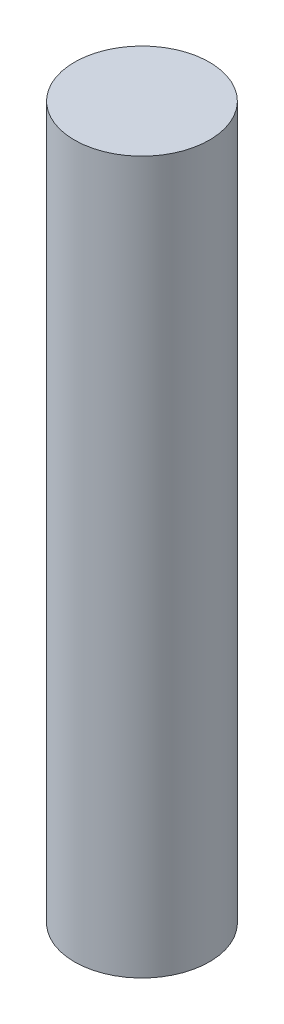
ISO-10303-21;
HEADER;
FILE_DESCRIPTION(('STEP AP214'),'2;1');
FILE_NAME('part.step','',(''),(''),'','','');
FILE_SCHEMA(('AUTOMOTIVE_DESIGN { 1 0 10303 214 1 1 1 1 }'));
ENDSEC;
DATA;
#1=APPLICATION_CONTEXT('core data for automotive mechanical design processes');
#2=APPLICATION_PROTOCOL_DEFINITION('international standard','automotive_design',2000,#1);
#3=PRODUCT_CONTEXT('',#1,'mechanical');
#4=PRODUCT('Part','Part','',(#3));
#5=PRODUCT_RELATED_PRODUCT_CATEGORY('part','',(#4));
#6=PRODUCT_DEFINITION_FORMATION('','',#4);
#7=PRODUCT_DEFINITION_CONTEXT('part definition',#1,'design');
#8=PRODUCT_DEFINITION('design','',#6,#7);
#9=PRODUCT_DEFINITION_SHAPE('','',#8);
#10=(LENGTH_UNIT() NAMED_UNIT(*) SI_UNIT(.MILLI.,.METRE.));
#11=(NAMED_UNIT(*) PLANE_ANGLE_UNIT() SI_UNIT($,.RADIAN.));
#12=(NAMED_UNIT(*) SI_UNIT($,.STERADIAN.) SOLID_ANGLE_UNIT());
#13=UNCERTAINTY_MEASURE_WITH_UNIT(LENGTH_MEASURE(1.E-05),#10,'distance_accuracy_value','');
#14=(GEOMETRIC_REPRESENTATION_CONTEXT(3) GLOBAL_UNCERTAINTY_ASSIGNED_CONTEXT((#13)) GLOBAL_UNIT_ASSIGNED_CONTEXT((#10,
#11,#12)) REPRESENTATION_CONTEXT('',''));
#15=CARTESIAN_POINT('',(0.,0.,0.));
#16=DIRECTION('',(0.,0.,1.));
#17=DIRECTION('',(1.,0.,0.));
#18=AXIS2_PLACEMENT_3D('',#15,#16,#17);
#19=CARTESIAN_POINT('',(0.,2900.,0.));
#20=DIRECTION('',(0.,-1.,0.));
#21=DIRECTION('',(0.,0.,-1.));
#22=AXIS2_PLACEMENT_3D('',#19,#20,#21);
#23=CYLINDRICAL_SURFACE('',#22,275.);
#24=CARTESIAN_POINT('',(0.,2900.,0.));
#25=DIRECTION('',(0.,1.,0.));
#26=DIRECTION('',(0.,0.,1.));
#27=AXIS2_PLACEMENT_3D('',#24,#25,#26);
#28=CIRCLE('',#27,275.);
#29=CARTESIAN_POINT('',(0.,2900.,275.));
#30=VERTEX_POINT('',#29);
#31=EDGE_CURVE('E10',#30,#30,#28,.T.);
#32=ORIENTED_EDGE('',*,*,#31,.F.);
#33=EDGE_LOOP('',(#32));
#34=FACE_BOUND('',#33,.T.);
#35=CARTESIAN_POINT('',(0.,0.,0.));
#36=DIRECTION('',(0.,1.,0.));
#37=DIRECTION('',(0.,0.,1.));
#38=AXIS2_PLACEMENT_3D('',#35,#36,#37);
#39=CIRCLE('',#38,275.);
#40=CARTESIAN_POINT('',(0.,0.,275.));
#41=VERTEX_POINT('',#40);
#42=EDGE_CURVE('E36',#41,#41,#39,.T.);
#43=ORIENTED_EDGE('',*,*,#42,.T.);
#44=EDGE_LOOP('',(#43));
#45=FACE_BOUND('',#44,.T.);
#46=ADVANCED_FACE('F33',(#34,#45),#23,.T.);
#47=CARTESIAN_POINT('',(0.,2900.,0.));
#48=DIRECTION('',(0.,1.,0.));
#49=DIRECTION('',(0.,0.,1.));
#50=AXIS2_PLACEMENT_3D('',#47,#48,#49);
#51=PLANE('',#50);
#52=ORIENTED_EDGE('',*,*,#31,.T.);
#53=EDGE_LOOP('',(#52));
#54=FACE_BOUND('',#53,.T.);
#55=ADVANCED_FACE('F48',(#54),#51,.T.);
#56=CARTESIAN_POINT('',(0.,0.,0.));
#57=DIRECTION('',(0.,1.,0.));
#58=DIRECTION('',(0.,0.,1.));
#59=AXIS2_PLACEMENT_3D('',#56,#57,#58);
#60=PLANE('',#59);
#61=ORIENTED_EDGE('',*,*,#42,.F.);
#62=EDGE_LOOP('',(#61));
#63=FACE_BOUND('',#62,.T.);
#64=ADVANCED_FACE('F46',(#63),#60,.F.);
#65=CLOSED_SHELL('',(#46,#55,#64));
#66=MANIFOLD_SOLID_BREP('B2',#65);
#67=ADVANCED_BREP_SHAPE_REPRESENTATION('',(#18,#66),#14);
#68=SHAPE_DEFINITION_REPRESENTATION(#9,#67);
ENDSEC;
END-ISO-10303-21;
